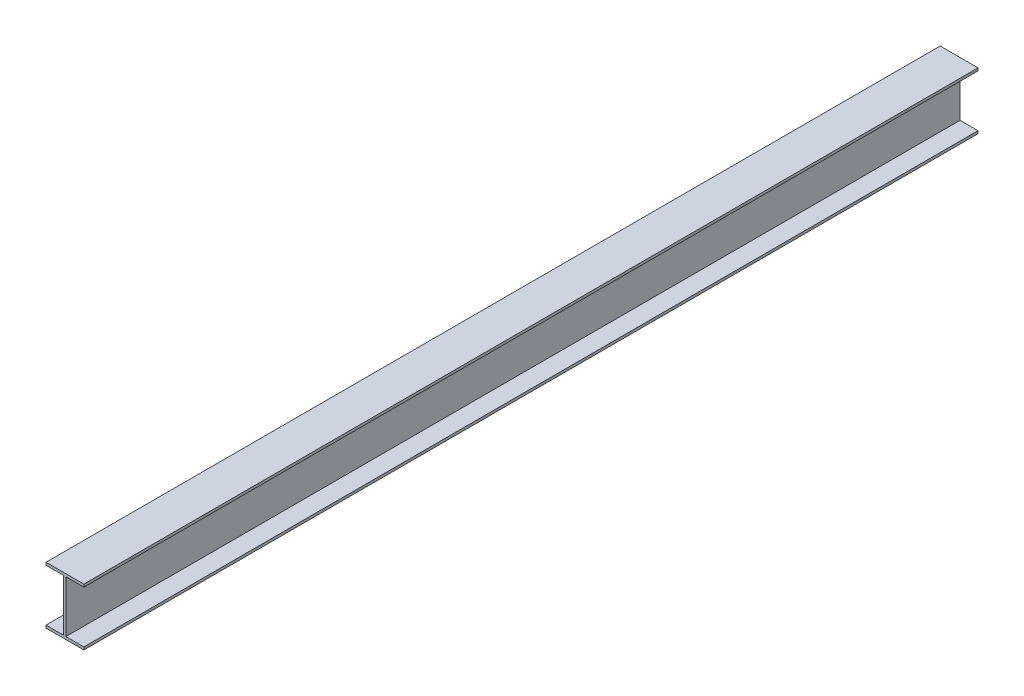
ISO-10303-21;
HEADER;
FILE_DESCRIPTION(('STEP AP214'),'2;1');
FILE_NAME('part.step','',(''),(''),'','','');
FILE_SCHEMA(('AUTOMOTIVE_DESIGN { 1 0 10303 214 1 1 1 1 }'));
ENDSEC;
DATA;
#1=APPLICATION_CONTEXT('core data for automotive mechanical design processes');
#2=APPLICATION_PROTOCOL_DEFINITION('international standard','automotive_design',2000,#1);
#3=PRODUCT_CONTEXT('',#1,'mechanical');
#4=PRODUCT('Part','Part','',(#3));
#5=PRODUCT_RELATED_PRODUCT_CATEGORY('part','',(#4));
#6=PRODUCT_DEFINITION_FORMATION('','',#4);
#7=PRODUCT_DEFINITION_CONTEXT('part definition',#1,'design');
#8=PRODUCT_DEFINITION('design','',#6,#7);
#9=PRODUCT_DEFINITION_SHAPE('','',#8);
#10=(LENGTH_UNIT() NAMED_UNIT(*) SI_UNIT(.MILLI.,.METRE.));
#11=(NAMED_UNIT(*) PLANE_ANGLE_UNIT() SI_UNIT($,.RADIAN.));
#12=(NAMED_UNIT(*) SI_UNIT($,.STERADIAN.) SOLID_ANGLE_UNIT());
#13=UNCERTAINTY_MEASURE_WITH_UNIT(LENGTH_MEASURE(1.E-05),#10,'distance_accuracy_value','');
#14=(GEOMETRIC_REPRESENTATION_CONTEXT(3) GLOBAL_UNCERTAINTY_ASSIGNED_CONTEXT((#13)) GLOBAL_UNIT_ASSIGNED_CONTEXT((#10,
#11,#12)) REPRESENTATION_CONTEXT('',''));
#15=CARTESIAN_POINT('',(0.,0.,0.));
#16=DIRECTION('',(0.,0.,1.));
#17=DIRECTION('',(1.,0.,0.));
#18=AXIS2_PLACEMENT_3D('',#15,#16,#17);
#19=CARTESIAN_POINT('',(0.,-7.11224053295814,2400.));
#20=DIRECTION('',(1.,0.,0.));
#21=DIRECTION('',(0.,0.,-1.));
#22=AXIS2_PLACEMENT_3D('',#19,#20,#21);
#23=PLANE('',#22);
#24=DIRECTION('',(0.,-1.,0.));
#25=VECTOR('',#24,1.);
#26=CARTESIAN_POINT('',(0.,-7.11224053295814,0.));
#27=LINE('',#26,#25);
#28=CARTESIAN_POINT('',(0.,-0.000240532958142959,0.));
#29=VERTEX_POINT('',#28);
#30=CARTESIAN_POINT('',(0.,-7.11224053295814,0.));
#31=VERTEX_POINT('',#30);
#32=EDGE_CURVE('E153',#29,#31,#27,.T.);
#33=ORIENTED_EDGE('',*,*,#32,.T.);
#34=DIRECTION('',(0.,0.,-1.));
#35=VECTOR('',#34,1.);
#36=CARTESIAN_POINT('',(0.,-7.11224053295814,2400.));
#37=LINE('',#36,#35);
#38=CARTESIAN_POINT('',(0.,-7.11224053295814,2400.));
#39=VERTEX_POINT('',#38);
#40=EDGE_CURVE('E11',#39,#31,#37,.T.);
#41=ORIENTED_EDGE('',*,*,#40,.F.);
#42=DIRECTION('',(0.,-1.,0.));
#43=VECTOR('',#42,1.);
#44=CARTESIAN_POINT('',(0.,-7.11224053295814,2400.));
#45=LINE('',#44,#43);
#46=CARTESIAN_POINT('',(0.,-0.000240532958142959,2400.));
#47=VERTEX_POINT('',#46);
#48=EDGE_CURVE('E175',#47,#39,#45,.T.);
#49=ORIENTED_EDGE('',*,*,#48,.F.);
#50=DIRECTION('',(0.,0.,-1.));
#51=VECTOR('',#50,1.);
#52=CARTESIAN_POINT('',(0.,-0.000240532958142959,2400.));
#53=LINE('',#52,#51);
#54=EDGE_CURVE('E149',#47,#29,#53,.T.);
#55=ORIENTED_EDGE('',*,*,#54,.T.);
#56=EDGE_LOOP('',(#33,#41,#49,#55));
#57=FACE_BOUND('',#56,.T.);
#58=ADVANCED_FACE('F33',(#57),#23,.F.);
#59=CARTESIAN_POINT('',(47.5660357142857,-7.11224053295814,2400.));
#60=DIRECTION('',(0.,1.,0.));
#61=DIRECTION('',(-1.,0.,0.));
#62=AXIS2_PLACEMENT_3D('',#59,#60,#61);
#63=PLANE('',#62);
#64=DIRECTION('',(1.,0.,0.));
#65=VECTOR('',#64,1.);
#66=CARTESIAN_POINT('',(47.5660357142857,-7.11224053295814,0.));
#67=LINE('',#66,#65);
#68=CARTESIAN_POINT('',(47.5660357142857,-7.11224053295814,0.));
#69=VERTEX_POINT('',#68);
#70=EDGE_CURVE('E156',#31,#69,#67,.T.);
#71=ORIENTED_EDGE('',*,*,#70,.T.);
#72=DIRECTION('',(0.,0.,-1.));
#73=VECTOR('',#72,1.);
#74=CARTESIAN_POINT('',(47.5660357142857,-7.11224053295814,2400.));
#75=LINE('',#74,#73);
#76=CARTESIAN_POINT('',(47.5660357142857,-7.11224053295814,2400.));
#77=VERTEX_POINT('',#76);
#78=EDGE_CURVE('E41',#77,#69,#75,.T.);
#79=ORIENTED_EDGE('',*,*,#78,.F.);
#80=DIRECTION('',(1.,0.,0.));
#81=VECTOR('',#80,1.);
#82=CARTESIAN_POINT('',(47.5660357142857,-7.11224053295814,2400.));
#83=LINE('',#82,#81);
#84=EDGE_CURVE('E104',#39,#77,#83,.T.);
#85=ORIENTED_EDGE('',*,*,#84,.F.);
#86=ORIENTED_EDGE('',*,*,#40,.T.);
#87=EDGE_LOOP('',(#71,#79,#85,#86));
#88=FACE_BOUND('',#87,.T.);
#89=ADVANCED_FACE('F253',(#88),#63,.F.);
#90=CARTESIAN_POINT('',(47.5660357142857,-146.050240532958,2400.));
#91=DIRECTION('',(1.,0.,0.));
#92=DIRECTION('',(0.,0.,-1.));
#93=AXIS2_PLACEMENT_3D('',#90,#91,#92);
#94=PLANE('',#93);
#95=DIRECTION('',(0.,-1.,0.));
#96=VECTOR('',#95,1.);
#97=CARTESIAN_POINT('',(47.5660357142857,-146.050240532958,0.));
#98=LINE('',#97,#96);
#99=CARTESIAN_POINT('',(47.5660357142857,-146.050240532958,0.));
#100=VERTEX_POINT('',#99);
#101=EDGE_CURVE('E158',#69,#100,#98,.T.);
#102=ORIENTED_EDGE('',*,*,#101,.T.);
#103=DIRECTION('',(0.,0.,-1.));
#104=VECTOR('',#103,1.);
#105=CARTESIAN_POINT('',(47.5660357142857,-146.050240532958,2400.));
#106=LINE('',#105,#104);
#107=CARTESIAN_POINT('',(47.5660357142857,-146.050240532958,2400.));
#108=VERTEX_POINT('',#107);
#109=EDGE_CURVE('E194',#108,#100,#106,.T.);
#110=ORIENTED_EDGE('',*,*,#109,.F.);
#111=DIRECTION('',(0.,-1.,0.));
#112=VECTOR('',#111,1.);
#113=CARTESIAN_POINT('',(47.5660357142857,-146.050240532958,2400.));
#114=LINE('',#113,#112);
#115=EDGE_CURVE('E202',#77,#108,#114,.T.);
#116=ORIENTED_EDGE('',*,*,#115,.F.);
#117=ORIENTED_EDGE('',*,*,#78,.T.);
#118=EDGE_LOOP('',(#102,#110,#116,#117));
#119=FACE_BOUND('',#118,.T.);
#120=ADVANCED_FACE('F200',(#119),#94,.F.);
#121=CARTESIAN_POINT('',(0.,-146.050240532958,2400.));
#122=DIRECTION('',(0.,-1.,0.));
#123=DIRECTION('',(1.,0.,0.));
#124=AXIS2_PLACEMENT_3D('',#121,#122,#123);
#125=PLANE('',#124);
#126=DIRECTION('',(-1.,0.,0.));
#127=VECTOR('',#126,1.);
#128=CARTESIAN_POINT('',(0.,-146.050240532958,0.));
#129=LINE('',#128,#127);
#130=CARTESIAN_POINT('',(0.,-146.050240532958,0.));
#131=VERTEX_POINT('',#130);
#132=EDGE_CURVE('E160',#100,#131,#129,.T.);
#133=ORIENTED_EDGE('',*,*,#132,.T.);
#134=DIRECTION('',(0.,0.,-1.));
#135=VECTOR('',#134,1.);
#136=CARTESIAN_POINT('',(0.,-146.050240532958,2400.));
#137=LINE('',#136,#135);
#138=CARTESIAN_POINT('',(0.,-146.050240532958,2400.));
#139=VERTEX_POINT('',#138);
#140=EDGE_CURVE('E191',#139,#131,#137,.T.);
#141=ORIENTED_EDGE('',*,*,#140,.F.);
#142=DIRECTION('',(-1.,0.,0.));
#143=VECTOR('',#142,1.);
#144=CARTESIAN_POINT('',(0.,-146.050240532958,2400.));
#145=LINE('',#144,#143);
#146=EDGE_CURVE('E220',#108,#139,#145,.T.);
#147=ORIENTED_EDGE('',*,*,#146,.F.);
#148=ORIENTED_EDGE('',*,*,#109,.T.);
#149=EDGE_LOOP('',(#133,#141,#147,#148));
#150=FACE_BOUND('',#149,.T.);
#151=ADVANCED_FACE('F211',(#150),#125,.F.);
#152=CARTESIAN_POINT('',(0.,-153.162240532958,2400.));
#153=DIRECTION('',(1.,0.,0.));
#154=DIRECTION('',(0.,0.,-1.));
#155=AXIS2_PLACEMENT_3D('',#152,#153,#154);
#156=PLANE('',#155);
#157=DIRECTION('',(0.,-1.,0.));
#158=VECTOR('',#157,1.);
#159=CARTESIAN_POINT('',(0.,-153.162240532958,0.));
#160=LINE('',#159,#158);
#161=CARTESIAN_POINT('',(0.,-153.162240532958,0.));
#162=VERTEX_POINT('',#161);
#163=EDGE_CURVE('E162',#131,#162,#160,.T.);
#164=ORIENTED_EDGE('',*,*,#163,.T.);
#165=DIRECTION('',(0.,0.,-1.));
#166=VECTOR('',#165,1.);
#167=CARTESIAN_POINT('',(0.,-153.162240532958,2400.));
#168=LINE('',#167,#166);
#169=CARTESIAN_POINT('',(0.,-153.162240532958,2400.));
#170=VERTEX_POINT('',#169);
#171=EDGE_CURVE('E188',#170,#162,#168,.T.);
#172=ORIENTED_EDGE('',*,*,#171,.F.);
#173=DIRECTION('',(0.,-1.,0.));
#174=VECTOR('',#173,1.);
#175=CARTESIAN_POINT('',(0.,-153.162240532958,2400.));
#176=LINE('',#175,#174);
#177=EDGE_CURVE('E217',#139,#170,#176,.T.);
#178=ORIENTED_EDGE('',*,*,#177,.F.);
#179=ORIENTED_EDGE('',*,*,#140,.T.);
#180=EDGE_LOOP('',(#164,#172,#178,#179));
#181=FACE_BOUND('',#180,.T.);
#182=ADVANCED_FACE('F215',(#181),#156,.F.);
#183=CARTESIAN_POINT('',(101.6,-153.162240532958,2400.));
#184=DIRECTION('',(0.,1.,0.));
#185=DIRECTION('',(0.,0.,1.));
#186=AXIS2_PLACEMENT_3D('',#183,#184,#185);
#187=PLANE('',#186);
#188=DIRECTION('',(1.,0.,0.));
#189=VECTOR('',#188,1.);
#190=CARTESIAN_POINT('',(101.6,-153.162240532958,0.));
#191=LINE('',#190,#189);
#192=CARTESIAN_POINT('',(101.6,-153.162240532958,0.));
#193=VERTEX_POINT('',#192);
#194=EDGE_CURVE('E164',#162,#193,#191,.T.);
#195=ORIENTED_EDGE('',*,*,#194,.T.);
#196=DIRECTION('',(0.,0.,-1.));
#197=VECTOR('',#196,1.);
#198=CARTESIAN_POINT('',(101.6,-153.162240532958,2400.));
#199=LINE('',#198,#197);
#200=CARTESIAN_POINT('',(101.6,-153.162240532958,2400.));
#201=VERTEX_POINT('',#200);
#202=EDGE_CURVE('E185',#201,#193,#199,.T.);
#203=ORIENTED_EDGE('',*,*,#202,.F.);
#204=DIRECTION('',(1.,0.,0.));
#205=VECTOR('',#204,1.);
#206=CARTESIAN_POINT('',(101.6,-153.162240532958,2400.));
#207=LINE('',#206,#205);
#208=EDGE_CURVE('E219',#170,#201,#207,.T.);
#209=ORIENTED_EDGE('',*,*,#208,.F.);
#210=ORIENTED_EDGE('',*,*,#171,.T.);
#211=EDGE_LOOP('',(#195,#203,#209,#210));
#212=FACE_BOUND('',#211,.T.);
#213=ADVANCED_FACE('F266',(#212),#187,.F.);
#214=CARTESIAN_POINT('',(101.6,-146.050240532958,2400.));
#215=DIRECTION('',(-1.,0.,0.));
#216=DIRECTION('',(0.,0.,1.));
#217=AXIS2_PLACEMENT_3D('',#214,#215,#216);
#218=PLANE('',#217);
#219=DIRECTION('',(0.,1.,0.));
#220=VECTOR('',#219,1.);
#221=CARTESIAN_POINT('',(101.6,-146.050240532958,0.));
#222=LINE('',#221,#220);
#223=CARTESIAN_POINT('',(101.6,-146.050240532958,0.));
#224=VERTEX_POINT('',#223);
#225=EDGE_CURVE('E166',#193,#224,#222,.T.);
#226=ORIENTED_EDGE('',*,*,#225,.T.);
#227=DIRECTION('',(0.,0.,-1.));
#228=VECTOR('',#227,1.);
#229=CARTESIAN_POINT('',(101.6,-146.050240532958,2400.));
#230=LINE('',#229,#228);
#231=CARTESIAN_POINT('',(101.6,-146.050240532958,2400.));
#232=VERTEX_POINT('',#231);
#233=EDGE_CURVE('E182',#232,#224,#230,.T.);
#234=ORIENTED_EDGE('',*,*,#233,.F.);
#235=DIRECTION('',(0.,1.,0.));
#236=VECTOR('',#235,1.);
#237=CARTESIAN_POINT('',(101.6,-146.050240532958,2400.));
#238=LINE('',#237,#236);
#239=EDGE_CURVE('E222',#201,#232,#238,.T.);
#240=ORIENTED_EDGE('',*,*,#239,.F.);
#241=ORIENTED_EDGE('',*,*,#202,.T.);
#242=EDGE_LOOP('',(#226,#234,#240,#241));
#243=FACE_BOUND('',#242,.T.);
#244=ADVANCED_FACE('F269',(#243),#218,.F.);
#245=CARTESIAN_POINT('',(53.4080357142857,-146.050240532958,2400.));
#246=DIRECTION('',(0.,-1.,0.));
#247=DIRECTION('',(1.,0.,0.));
#248=AXIS2_PLACEMENT_3D('',#245,#246,#247);
#249=PLANE('',#248);
#250=DIRECTION('',(-1.,0.,0.));
#251=VECTOR('',#250,1.);
#252=CARTESIAN_POINT('',(53.4080357142857,-146.050240532958,0.));
#253=LINE('',#252,#251);
#254=CARTESIAN_POINT('',(53.4080357142857,-146.050240532958,0.));
#255=VERTEX_POINT('',#254);
#256=EDGE_CURVE('E168',#224,#255,#253,.T.);
#257=ORIENTED_EDGE('',*,*,#256,.T.);
#258=DIRECTION('',(0.,0.,-1.));
#259=VECTOR('',#258,1.);
#260=CARTESIAN_POINT('',(53.4080357142857,-146.050240532958,2400.));
#261=LINE('',#260,#259);
#262=CARTESIAN_POINT('',(53.4080357142857,-146.050240532958,2400.));
#263=VERTEX_POINT('',#262);
#264=EDGE_CURVE('E179',#263,#255,#261,.T.);
#265=ORIENTED_EDGE('',*,*,#264,.F.);
#266=DIRECTION('',(-1.,0.,0.));
#267=VECTOR('',#266,1.);
#268=CARTESIAN_POINT('',(53.4080357142857,-146.050240532958,2400.));
#269=LINE('',#268,#267);
#270=EDGE_CURVE('E228',#232,#263,#269,.T.);
#271=ORIENTED_EDGE('',*,*,#270,.F.);
#272=ORIENTED_EDGE('',*,*,#233,.T.);
#273=EDGE_LOOP('',(#257,#265,#271,#272));
#274=FACE_BOUND('',#273,.T.);
#275=ADVANCED_FACE('F234',(#274),#249,.F.);
#276=CARTESIAN_POINT('',(53.4080357142857,-7.11224053295815,2400.));
#277=DIRECTION('',(-1.,0.,0.));
#278=DIRECTION('',(0.,-1.,0.));
#279=AXIS2_PLACEMENT_3D('',#276,#277,#278);
#280=PLANE('',#279);
#281=DIRECTION('',(0.,1.,0.));
#282=VECTOR('',#281,1.);
#283=CARTESIAN_POINT('',(53.4080357142857,-7.11224053295815,0.));
#284=LINE('',#283,#282);
#285=CARTESIAN_POINT('',(53.4080357142857,-7.11224053295815,0.));
#286=VERTEX_POINT('',#285);
#287=EDGE_CURVE('E170',#255,#286,#284,.T.);
#288=ORIENTED_EDGE('',*,*,#287,.T.);
#289=DIRECTION('',(0.,0.,-1.));
#290=VECTOR('',#289,1.);
#291=CARTESIAN_POINT('',(53.4080357142857,-7.11224053295815,2400.));
#292=LINE('',#291,#290);
#293=CARTESIAN_POINT('',(53.4080357142857,-7.11224053295815,2400.));
#294=VERTEX_POINT('',#293);
#295=EDGE_CURVE('E144',#294,#286,#292,.T.);
#296=ORIENTED_EDGE('',*,*,#295,.F.);
#297=DIRECTION('',(0.,1.,0.));
#298=VECTOR('',#297,1.);
#299=CARTESIAN_POINT('',(53.4080357142857,-7.11224053295815,2400.));
#300=LINE('',#299,#298);
#301=EDGE_CURVE('E135',#263,#294,#300,.T.);
#302=ORIENTED_EDGE('',*,*,#301,.F.);
#303=ORIENTED_EDGE('',*,*,#264,.T.);
#304=EDGE_LOOP('',(#288,#296,#302,#303));
#305=FACE_BOUND('',#304,.T.);
#306=ADVANCED_FACE('F238',(#305),#280,.F.);
#307=CARTESIAN_POINT('',(101.6,-7.11224053295814,2400.));
#308=DIRECTION('',(0.,1.,0.));
#309=DIRECTION('',(-1.,0.,0.));
#310=AXIS2_PLACEMENT_3D('',#307,#308,#309);
#311=PLANE('',#310);
#312=DIRECTION('',(1.,0.,0.));
#313=VECTOR('',#312,1.);
#314=CARTESIAN_POINT('',(101.6,-7.11224053295814,0.));
#315=LINE('',#314,#313);
#316=CARTESIAN_POINT('',(101.6,-7.11224053295814,0.));
#317=VERTEX_POINT('',#316);
#318=EDGE_CURVE('E143',#286,#317,#315,.T.);
#319=ORIENTED_EDGE('',*,*,#318,.T.);
#320=DIRECTION('',(0.,0.,-1.));
#321=VECTOR('',#320,1.);
#322=CARTESIAN_POINT('',(101.6,-7.11224053295814,2400.));
#323=LINE('',#322,#321);
#324=CARTESIAN_POINT('',(101.6,-7.11224053295814,2400.));
#325=VERTEX_POINT('',#324);
#326=EDGE_CURVE('E140',#325,#317,#323,.T.);
#327=ORIENTED_EDGE('',*,*,#326,.F.);
#328=DIRECTION('',(1.,0.,0.));
#329=VECTOR('',#328,1.);
#330=CARTESIAN_POINT('',(101.6,-7.11224053295814,2400.));
#331=LINE('',#330,#329);
#332=EDGE_CURVE('E129',#294,#325,#331,.T.);
#333=ORIENTED_EDGE('',*,*,#332,.F.);
#334=ORIENTED_EDGE('',*,*,#295,.T.);
#335=EDGE_LOOP('',(#319,#327,#333,#334));
#336=FACE_BOUND('',#335,.T.);
#337=ADVANCED_FACE('F141',(#336),#311,.F.);
#338=CARTESIAN_POINT('',(101.6,-0.000240532958130516,2400.));
#339=DIRECTION('',(-1.,0.,0.));
#340=DIRECTION('',(0.,0.,1.));
#341=AXIS2_PLACEMENT_3D('',#338,#339,#340);
#342=PLANE('',#341);
#343=DIRECTION('',(0.,1.,0.));
#344=VECTOR('',#343,1.);
#345=CARTESIAN_POINT('',(101.6,-0.000240532958130516,0.));
#346=LINE('',#345,#344);
#347=CARTESIAN_POINT('',(101.6,-0.000240532958130516,0.));
#348=VERTEX_POINT('',#347);
#349=EDGE_CURVE('E90',#317,#348,#346,.T.);
#350=ORIENTED_EDGE('',*,*,#349,.T.);
#351=DIRECTION('',(0.,0.,-1.));
#352=VECTOR('',#351,1.);
#353=CARTESIAN_POINT('',(101.6,-0.000240532958130516,2400.));
#354=LINE('',#353,#352);
#355=CARTESIAN_POINT('',(101.6,-0.000240532958130516,2400.));
#356=VERTEX_POINT('',#355);
#357=EDGE_CURVE('E145',#356,#348,#354,.T.);
#358=ORIENTED_EDGE('',*,*,#357,.F.);
#359=DIRECTION('',(0.,1.,0.));
#360=VECTOR('',#359,1.);
#361=CARTESIAN_POINT('',(101.6,-0.000240532958130516,2400.));
#362=LINE('',#361,#360);
#363=EDGE_CURVE('E133',#325,#356,#362,.T.);
#364=ORIENTED_EDGE('',*,*,#363,.F.);
#365=ORIENTED_EDGE('',*,*,#326,.T.);
#366=EDGE_LOOP('',(#350,#358,#364,#365));
#367=FACE_BOUND('',#366,.T.);
#368=ADVANCED_FACE('F147',(#367),#342,.F.);
#369=CARTESIAN_POINT('',(0.,-0.000240532958142959,2400.));
#370=DIRECTION('',(0.,-1.,0.));
#371=DIRECTION('',(1.,0.,0.));
#372=AXIS2_PLACEMENT_3D('',#369,#370,#371);
#373=PLANE('',#372);
#374=DIRECTION('',(-1.,0.,0.));
#375=VECTOR('',#374,1.);
#376=CARTESIAN_POINT('',(0.,-0.000240532958142959,0.));
#377=LINE('',#376,#375);
#378=EDGE_CURVE('E96',#348,#29,#377,.T.);
#379=ORIENTED_EDGE('',*,*,#378,.T.);
#380=ORIENTED_EDGE('',*,*,#54,.F.);
#381=DIRECTION('',(-1.,0.,0.));
#382=VECTOR('',#381,1.);
#383=CARTESIAN_POINT('',(0.,-0.000240532958142959,2400.));
#384=LINE('',#383,#382);
#385=EDGE_CURVE('E49',#356,#47,#384,.T.);
#386=ORIENTED_EDGE('',*,*,#385,.F.);
#387=ORIENTED_EDGE('',*,*,#357,.T.);
#388=EDGE_LOOP('',(#379,#380,#386,#387));
#389=FACE_BOUND('',#388,.T.);
#390=ADVANCED_FACE('F242',(#389),#373,.F.);
#391=CARTESIAN_POINT('',(0.,0.,2400.));
#392=DIRECTION('',(0.,0.,-1.));
#393=DIRECTION('',(-1.,0.,0.));
#394=AXIS2_PLACEMENT_3D('',#391,#392,#393);
#395=PLANE('',#394);
#396=ORIENTED_EDGE('',*,*,#48,.T.);
#397=ORIENTED_EDGE('',*,*,#84,.T.);
#398=ORIENTED_EDGE('',*,*,#115,.T.);
#399=ORIENTED_EDGE('',*,*,#146,.T.);
#400=ORIENTED_EDGE('',*,*,#177,.T.);
#401=ORIENTED_EDGE('',*,*,#208,.T.);
#402=ORIENTED_EDGE('',*,*,#239,.T.);
#403=ORIENTED_EDGE('',*,*,#270,.T.);
#404=ORIENTED_EDGE('',*,*,#301,.T.);
#405=ORIENTED_EDGE('',*,*,#332,.T.);
#406=ORIENTED_EDGE('',*,*,#363,.T.);
#407=ORIENTED_EDGE('',*,*,#385,.T.);
#408=EDGE_LOOP('',(#396,#397,#398,#399,#400,#401,#402,#403,#404,#405,#406,#407));
#409=FACE_BOUND('',#408,.T.);
#410=ADVANCED_FACE('F131',(#409),#395,.F.);
#411=CARTESIAN_POINT('',(0.,0.,0.));
#412=DIRECTION('',(0.,0.,-1.));
#413=DIRECTION('',(-1.,0.,0.));
#414=AXIS2_PLACEMENT_3D('',#411,#412,#413);
#415=PLANE('',#414);
#416=ORIENTED_EDGE('',*,*,#32,.F.);
#417=ORIENTED_EDGE('',*,*,#378,.F.);
#418=ORIENTED_EDGE('',*,*,#349,.F.);
#419=ORIENTED_EDGE('',*,*,#318,.F.);
#420=ORIENTED_EDGE('',*,*,#287,.F.);
#421=ORIENTED_EDGE('',*,*,#256,.F.);
#422=ORIENTED_EDGE('',*,*,#225,.F.);
#423=ORIENTED_EDGE('',*,*,#194,.F.);
#424=ORIENTED_EDGE('',*,*,#163,.F.);
#425=ORIENTED_EDGE('',*,*,#132,.F.);
#426=ORIENTED_EDGE('',*,*,#101,.F.);
#427=ORIENTED_EDGE('',*,*,#70,.F.);
#428=EDGE_LOOP('',(#416,#417,#418,#419,#420,#421,#422,#423,#424,#425,#426,#427));
#429=FACE_BOUND('',#428,.T.);
#430=ADVANCED_FACE('F206',(#429),#415,.T.);
#431=CLOSED_SHELL('',(#58,#89,#120,#151,#182,#213,#244,#275,#306,#337,#368,#390,#410,#430));
#432=MANIFOLD_SOLID_BREP('B2',#431);
#433=ADVANCED_BREP_SHAPE_REPRESENTATION('',(#18,#432),#14);
#434=SHAPE_DEFINITION_REPRESENTATION(#9,#433);
ENDSEC;
END-ISO-10303-21;
